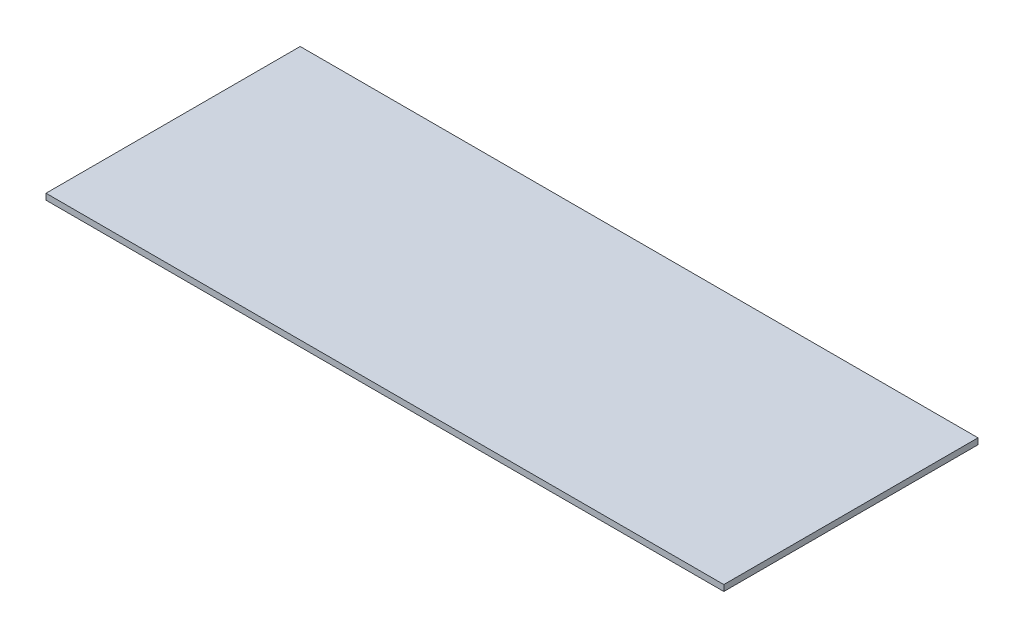
ISO-10303-21;
HEADER;
FILE_DESCRIPTION(('STEP AP214'),'2;1');
FILE_NAME('part.step','',(''),(''),'','','');
FILE_SCHEMA(('AUTOMOTIVE_DESIGN { 1 0 10303 214 1 1 1 1 }'));
ENDSEC;
DATA;
#1=APPLICATION_CONTEXT('core data for automotive mechanical design processes');
#2=APPLICATION_PROTOCOL_DEFINITION('international standard','automotive_design',2000,#1);
#3=PRODUCT_CONTEXT('',#1,'mechanical');
#4=PRODUCT('Part','Part','',(#3));
#5=PRODUCT_RELATED_PRODUCT_CATEGORY('part','',(#4));
#6=PRODUCT_DEFINITION_FORMATION('','',#4);
#7=PRODUCT_DEFINITION_CONTEXT('part definition',#1,'design');
#8=PRODUCT_DEFINITION('design','',#6,#7);
#9=PRODUCT_DEFINITION_SHAPE('','',#8);
#10=(LENGTH_UNIT() NAMED_UNIT(*) SI_UNIT(.MILLI.,.METRE.));
#11=(NAMED_UNIT(*) PLANE_ANGLE_UNIT() SI_UNIT($,.RADIAN.));
#12=(NAMED_UNIT(*) SI_UNIT($,.STERADIAN.) SOLID_ANGLE_UNIT());
#13=UNCERTAINTY_MEASURE_WITH_UNIT(LENGTH_MEASURE(1.E-05),#10,'distance_accuracy_value','');
#14=(GEOMETRIC_REPRESENTATION_CONTEXT(3) GLOBAL_UNCERTAINTY_ASSIGNED_CONTEXT((#13)) GLOBAL_UNIT_ASSIGNED_CONTEXT((#10,
#11,#12)) REPRESENTATION_CONTEXT('',''));
#15=CARTESIAN_POINT('',(0.,0.,0.));
#16=DIRECTION('',(0.,0.,1.));
#17=DIRECTION('',(1.,0.,0.));
#18=AXIS2_PLACEMENT_3D('',#15,#16,#17);
#19=CARTESIAN_POINT('',(177.8,1.5875,66.675));
#20=DIRECTION('',(-1.,0.,0.));
#21=DIRECTION('',(0.,0.,1.));
#22=AXIS2_PLACEMENT_3D('',#19,#20,#21);
#23=PLANE('',#22);
#24=DIRECTION('',(0.,0.,-1.));
#25=VECTOR('',#24,1.);
#26=CARTESIAN_POINT('',(177.8,-1.5875,66.675));
#27=LINE('',#26,#25);
#28=CARTESIAN_POINT('',(177.8,-1.5875,66.675));
#29=VERTEX_POINT('',#28);
#30=CARTESIAN_POINT('',(177.8,-1.5875,-66.675));
#31=VERTEX_POINT('',#30);
#32=EDGE_CURVE('E107',#29,#31,#27,.T.);
#33=ORIENTED_EDGE('',*,*,#32,.T.);
#34=DIRECTION('',(0.,-1.,0.));
#35=VECTOR('',#34,1.);
#36=CARTESIAN_POINT('',(177.8,1.5875,-66.675));
#37=LINE('',#36,#35);
#38=CARTESIAN_POINT('',(177.8,1.5875,-66.675));
#39=VERTEX_POINT('',#38);
#40=EDGE_CURVE('E11',#39,#31,#37,.T.);
#41=ORIENTED_EDGE('',*,*,#40,.F.);
#42=DIRECTION('',(0.,0.,-1.));
#43=VECTOR('',#42,1.);
#44=CARTESIAN_POINT('',(177.8,1.5875,66.675));
#45=LINE('',#44,#43);
#46=CARTESIAN_POINT('',(177.8,1.5875,66.675));
#47=VERTEX_POINT('',#46);
#48=EDGE_CURVE('E91',#47,#39,#45,.T.);
#49=ORIENTED_EDGE('',*,*,#48,.F.);
#50=DIRECTION('',(0.,-1.,0.));
#51=VECTOR('',#50,1.);
#52=CARTESIAN_POINT('',(177.8,1.5875,66.675));
#53=LINE('',#52,#51);
#54=EDGE_CURVE('E103',#47,#29,#53,.T.);
#55=ORIENTED_EDGE('',*,*,#54,.T.);
#56=EDGE_LOOP('',(#33,#41,#49,#55));
#57=FACE_BOUND('',#56,.T.);
#58=ADVANCED_FACE('F39',(#57),#23,.F.);
#59=CARTESIAN_POINT('',(-177.8,1.5875,-66.675));
#60=DIRECTION('',(0.,0.,1.));
#61=DIRECTION('',(1.,0.,0.));
#62=AXIS2_PLACEMENT_3D('',#59,#60,#61);
#63=PLANE('',#62);
#64=DIRECTION('',(-1.,0.,0.));
#65=VECTOR('',#64,1.);
#66=CARTESIAN_POINT('',(-177.8,-1.5875,-66.675));
#67=LINE('',#66,#65);
#68=CARTESIAN_POINT('',(-177.8,-1.5875,-66.675));
#69=VERTEX_POINT('',#68);
#70=EDGE_CURVE('E96',#31,#69,#67,.T.);
#71=ORIENTED_EDGE('',*,*,#70,.T.);
#72=DIRECTION('',(0.,-1.,0.));
#73=VECTOR('',#72,1.);
#74=CARTESIAN_POINT('',(-177.8,1.5875,-66.675));
#75=LINE('',#74,#73);
#76=CARTESIAN_POINT('',(-177.8,1.5875,-66.675));
#77=VERTEX_POINT('',#76);
#78=EDGE_CURVE('E48',#77,#69,#75,.T.);
#79=ORIENTED_EDGE('',*,*,#78,.F.);
#80=DIRECTION('',(-1.,0.,0.));
#81=VECTOR('',#80,1.);
#82=CARTESIAN_POINT('',(-177.8,1.5875,-66.675));
#83=LINE('',#82,#81);
#84=EDGE_CURVE('E86',#39,#77,#83,.T.);
#85=ORIENTED_EDGE('',*,*,#84,.F.);
#86=ORIENTED_EDGE('',*,*,#40,.T.);
#87=EDGE_LOOP('',(#71,#79,#85,#86));
#88=FACE_BOUND('',#87,.T.);
#89=ADVANCED_FACE('F95',(#88),#63,.F.);
#90=CARTESIAN_POINT('',(-177.8,1.5875,66.675));
#91=DIRECTION('',(1.,0.,0.));
#92=DIRECTION('',(0.,0.,-1.));
#93=AXIS2_PLACEMENT_3D('',#90,#91,#92);
#94=PLANE('',#93);
#95=DIRECTION('',(0.,0.,1.));
#96=VECTOR('',#95,1.);
#97=CARTESIAN_POINT('',(-177.8,-1.5875,66.675));
#98=LINE('',#97,#96);
#99=CARTESIAN_POINT('',(-177.8,-1.5875,66.675));
#100=VERTEX_POINT('',#99);
#101=EDGE_CURVE('E73',#69,#100,#98,.T.);
#102=ORIENTED_EDGE('',*,*,#101,.T.);
#103=DIRECTION('',(0.,-1.,0.));
#104=VECTOR('',#103,1.);
#105=CARTESIAN_POINT('',(-177.8,1.5875,66.675));
#106=LINE('',#105,#104);
#107=CARTESIAN_POINT('',(-177.8,1.5875,66.675));
#108=VERTEX_POINT('',#107);
#109=EDGE_CURVE('E98',#108,#100,#106,.T.);
#110=ORIENTED_EDGE('',*,*,#109,.F.);
#111=DIRECTION('',(0.,0.,1.));
#112=VECTOR('',#111,1.);
#113=CARTESIAN_POINT('',(-177.8,1.5875,66.675));
#114=LINE('',#113,#112);
#115=EDGE_CURVE('E89',#77,#108,#114,.T.);
#116=ORIENTED_EDGE('',*,*,#115,.F.);
#117=ORIENTED_EDGE('',*,*,#78,.T.);
#118=EDGE_LOOP('',(#102,#110,#116,#117));
#119=FACE_BOUND('',#118,.T.);
#120=ADVANCED_FACE('F99',(#119),#94,.F.);
#121=CARTESIAN_POINT('',(-177.8,1.5875,66.675));
#122=DIRECTION('',(0.,0.,-1.));
#123=DIRECTION('',(-1.,0.,0.));
#124=AXIS2_PLACEMENT_3D('',#121,#122,#123);
#125=PLANE('',#124);
#126=DIRECTION('',(1.,0.,0.));
#127=VECTOR('',#126,1.);
#128=CARTESIAN_POINT('',(-177.8,-1.5875,66.675));
#129=LINE('',#128,#127);
#130=EDGE_CURVE('E79',#100,#29,#129,.T.);
#131=ORIENTED_EDGE('',*,*,#130,.T.);
#132=ORIENTED_EDGE('',*,*,#54,.F.);
#133=DIRECTION('',(1.,0.,0.));
#134=VECTOR('',#133,1.);
#135=CARTESIAN_POINT('',(-177.8,1.5875,66.675));
#136=LINE('',#135,#134);
#137=EDGE_CURVE('E56',#108,#47,#136,.T.);
#138=ORIENTED_EDGE('',*,*,#137,.F.);
#139=ORIENTED_EDGE('',*,*,#109,.T.);
#140=EDGE_LOOP('',(#131,#132,#138,#139));
#141=FACE_BOUND('',#140,.T.);
#142=ADVANCED_FACE('F120',(#141),#125,.F.);
#143=CARTESIAN_POINT('',(0.,1.5875,0.));
#144=DIRECTION('',(0.,-1.,0.));
#145=DIRECTION('',(0.,0.,-1.));
#146=AXIS2_PLACEMENT_3D('',#143,#144,#145);
#147=PLANE('',#146);
#148=ORIENTED_EDGE('',*,*,#48,.T.);
#149=ORIENTED_EDGE('',*,*,#84,.T.);
#150=ORIENTED_EDGE('',*,*,#115,.T.);
#151=ORIENTED_EDGE('',*,*,#137,.T.);
#152=EDGE_LOOP('',(#148,#149,#150,#151));
#153=FACE_BOUND('',#152,.T.);
#154=ADVANCED_FACE('F87',(#153),#147,.F.);
#155=CARTESIAN_POINT('',(0.,-1.5875,0.));
#156=DIRECTION('',(0.,-1.,0.));
#157=DIRECTION('',(0.,0.,-1.));
#158=AXIS2_PLACEMENT_3D('',#155,#156,#157);
#159=PLANE('',#158);
#160=ORIENTED_EDGE('',*,*,#32,.F.);
#161=ORIENTED_EDGE('',*,*,#130,.F.);
#162=ORIENTED_EDGE('',*,*,#101,.F.);
#163=ORIENTED_EDGE('',*,*,#70,.F.);
#164=EDGE_LOOP('',(#160,#161,#162,#163));
#165=FACE_BOUND('',#164,.T.);
#166=ADVANCED_FACE('F123',(#165),#159,.T.);
#167=CLOSED_SHELL('',(#58,#89,#120,#142,#154,#166));
#168=MANIFOLD_SOLID_BREP('B2',#167);
#169=ADVANCED_BREP_SHAPE_REPRESENTATION('',(#18,#168),#14);
#170=SHAPE_DEFINITION_REPRESENTATION(#9,#169);
ENDSEC;
END-ISO-10303-21;
